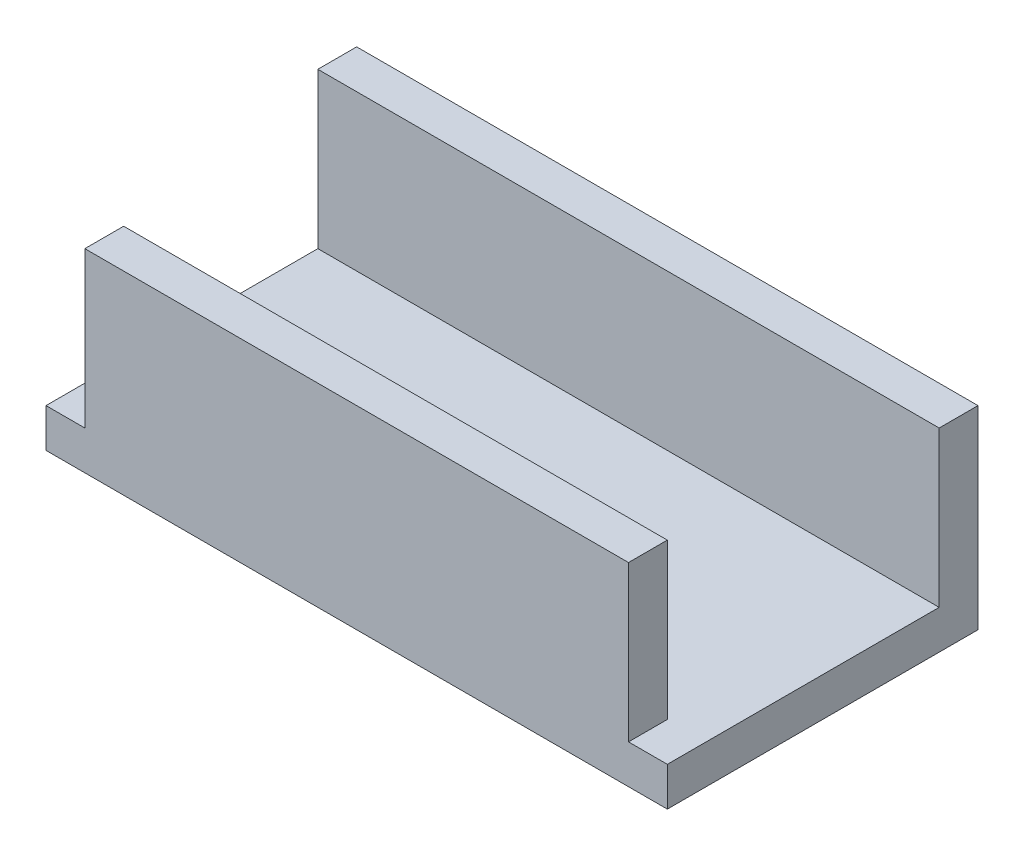
ISO-10303-21;
HEADER;
FILE_DESCRIPTION(('STEP AP214'),'2;1');
FILE_NAME('part.step','',(''),(''),'','','');
FILE_SCHEMA(('AUTOMOTIVE_DESIGN { 1 0 10303 214 1 1 1 1 }'));
ENDSEC;
DATA;
#1=APPLICATION_CONTEXT('core data for automotive mechanical design processes');
#2=APPLICATION_PROTOCOL_DEFINITION('international standard','automotive_design',2000,#1);
#3=PRODUCT_CONTEXT('',#1,'mechanical');
#4=PRODUCT('Part','Part','',(#3));
#5=PRODUCT_RELATED_PRODUCT_CATEGORY('part','',(#4));
#6=PRODUCT_DEFINITION_FORMATION('','',#4);
#7=PRODUCT_DEFINITION_CONTEXT('part definition',#1,'design');
#8=PRODUCT_DEFINITION('design','',#6,#7);
#9=PRODUCT_DEFINITION_SHAPE('','',#8);
#10=(LENGTH_UNIT() NAMED_UNIT(*) SI_UNIT(.MILLI.,.METRE.));
#11=(NAMED_UNIT(*) PLANE_ANGLE_UNIT() SI_UNIT($,.RADIAN.));
#12=(NAMED_UNIT(*) SI_UNIT($,.STERADIAN.) SOLID_ANGLE_UNIT());
#13=UNCERTAINTY_MEASURE_WITH_UNIT(LENGTH_MEASURE(1.E-05),#10,'distance_accuracy_value','');
#14=(GEOMETRIC_REPRESENTATION_CONTEXT(3) GLOBAL_UNCERTAINTY_ASSIGNED_CONTEXT((#13)) GLOBAL_UNIT_ASSIGNED_CONTEXT((#10,
#11,#12)) REPRESENTATION_CONTEXT('',''));
#15=CARTESIAN_POINT('',(0.,0.,0.));
#16=DIRECTION('',(0.,0.,1.));
#17=DIRECTION('',(1.,0.,0.));
#18=AXIS2_PLACEMENT_3D('',#15,#16,#17);
#19=CARTESIAN_POINT('',(3.14510667976366,22.664788813589,0.35));
#20=DIRECTION('',(0.,0.,1.));
#21=DIRECTION('',(-1.19248806385E-08,1.,0.));
#22=AXIS2_PLACEMENT_3D('',#19,#20,#21);
#23=PLANE('',#22);
#24=DIRECTION('',(1.19248806385E-08,-1.,0.));
#25=VECTOR('',#24,1.);
#26=CARTESIAN_POINT('',(3.89510667737868,22.8647888225327,0.35));
#27=LINE('',#26,#25);
#28=CARTESIAN_POINT('',(3.89510667737868,22.8647888225327,0.35));
#29=VERTEX_POINT('',#28);
#30=CARTESIAN_POINT('',(3.89510667976366,22.6647888225327,0.35));
#31=VERTEX_POINT('',#30);
#32=EDGE_CURVE('E11',#29,#31,#27,.T.);
#33=ORIENTED_EDGE('',*,*,#32,.T.);
#34=DIRECTION('',(-1.,-1.19248806385E-08,0.));
#35=VECTOR('',#34,1.);
#36=CARTESIAN_POINT('',(3.89510667976366,22.6647888225327,0.35));
#37=LINE('',#36,#35);
#38=CARTESIAN_POINT('',(3.19510667976366,22.6647888141853,0.35));
#39=VERTEX_POINT('',#38);
#40=EDGE_CURVE('E123',#31,#39,#37,.T.);
#41=ORIENTED_EDGE('',*,*,#40,.T.);
#42=DIRECTION('',(-1.19248806385E-08,1.,0.));
#43=VECTOR('',#42,1.);
#44=CARTESIAN_POINT('',(3.19510667976366,22.6647888141853,0.35));
#45=LINE('',#44,#43);
#46=CARTESIAN_POINT('',(3.19510667737868,22.8647888141853,0.35));
#47=VERTEX_POINT('',#46);
#48=EDGE_CURVE('E116',#39,#47,#45,.T.);
#49=ORIENTED_EDGE('',*,*,#48,.T.);
#50=DIRECTION('',(-1.,-1.19248806385E-08,0.));
#51=VECTOR('',#50,1.);
#52=CARTESIAN_POINT('',(3.89510667737868,22.8647888225327,0.35));
#53=LINE('',#52,#51);
#54=EDGE_CURVE('E108',#29,#47,#53,.T.);
#55=ORIENTED_EDGE('',*,*,#54,.F.);
#56=EDGE_LOOP('',(#33,#41,#49,#55));
#57=FACE_BOUND('',#56,.T.);
#58=ADVANCED_FACE('F16',(#57),#23,.F.);
#59=CARTESIAN_POINT('',(3.89510667737868,22.8647888225327,0.35));
#60=DIRECTION('',(-1.,-1.19248806385E-08,0.));
#61=DIRECTION('',(0.,0.,-1.));
#62=AXIS2_PLACEMENT_3D('',#59,#60,#61);
#63=PLANE('',#62);
#64=DIRECTION('',(0.,0.,-1.));
#65=VECTOR('',#64,1.);
#66=CARTESIAN_POINT('',(3.89510667976366,22.6647888225327,0.4));
#67=LINE('',#66,#65);
#68=CARTESIAN_POINT('',(3.89510667976366,22.6647888225327,0.4));
#69=VERTEX_POINT('',#68);
#70=EDGE_CURVE('E127',#69,#31,#67,.T.);
#71=ORIENTED_EDGE('',*,*,#70,.T.);
#72=ORIENTED_EDGE('',*,*,#32,.F.);
#73=DIRECTION('',(0.,0.,-1.));
#74=VECTOR('',#73,1.);
#75=CARTESIAN_POINT('',(3.89510667737868,22.8647888225327,0.4));
#76=LINE('',#75,#74);
#77=CARTESIAN_POINT('',(3.89510667737868,22.8647888225327,0.4));
#78=VERTEX_POINT('',#77);
#79=EDGE_CURVE('E113',#78,#29,#76,.T.);
#80=ORIENTED_EDGE('',*,*,#79,.F.);
#81=DIRECTION('',(1.19248806385E-08,-1.,0.));
#82=VECTOR('',#81,1.);
#83=CARTESIAN_POINT('',(3.89510667737868,22.8647888225327,0.4));
#84=LINE('',#83,#82);
#85=EDGE_CURVE('E132',#78,#69,#84,.T.);
#86=ORIENTED_EDGE('',*,*,#85,.T.);
#87=EDGE_LOOP('',(#71,#72,#80,#86));
#88=FACE_BOUND('',#87,.T.);
#89=ADVANCED_FACE('F324',(#88),#63,.F.);
#90=CARTESIAN_POINT('',(3.14510667737868,22.8647888135891,0.35));
#91=DIRECTION('',(-1.19248806385E-08,1.,0.));
#92=DIRECTION('',(1.,1.19248806385E-08,0.));
#93=AXIS2_PLACEMENT_3D('',#90,#91,#92);
#94=PLANE('',#93);
#95=DIRECTION('',(-1.,-1.19248806385E-08,0.));
#96=VECTOR('',#95,1.);
#97=CARTESIAN_POINT('',(3.14510667737868,22.8647888135891,0.));
#98=LINE('',#97,#96);
#99=CARTESIAN_POINT('',(3.94510667737869,22.864788823129,0.));
#100=VERTEX_POINT('',#99);
#101=CARTESIAN_POINT('',(3.14510667737868,22.8647888135891,0.));
#102=VERTEX_POINT('',#101);
#103=EDGE_CURVE('E27',#100,#102,#98,.T.);
#104=ORIENTED_EDGE('',*,*,#103,.T.);
#105=DIRECTION('',(0.,0.,1.));
#106=VECTOR('',#105,1.);
#107=CARTESIAN_POINT('',(3.14510667737868,22.8647888135891,0.35));
#108=LINE('',#107,#106);
#109=CARTESIAN_POINT('',(3.14510667737868,22.8647888135891,0.05));
#110=VERTEX_POINT('',#109);
#111=EDGE_CURVE('E72',#102,#110,#108,.T.);
#112=ORIENTED_EDGE('',*,*,#111,.T.);
#113=DIRECTION('',(-1.,-1.19248806385E-08,0.));
#114=VECTOR('',#113,1.);
#115=CARTESIAN_POINT('',(3.14510667737868,22.8647888135891,0.05));
#116=LINE('',#115,#114);
#117=CARTESIAN_POINT('',(3.94510667737869,22.864788823129,0.05));
#118=VERTEX_POINT('',#117);
#119=EDGE_CURVE('E76',#118,#110,#116,.T.);
#120=ORIENTED_EDGE('',*,*,#119,.F.);
#121=DIRECTION('',(0.,0.,1.));
#122=VECTOR('',#121,1.);
#123=CARTESIAN_POINT('',(3.94510667737869,22.864788823129,0.05));
#124=LINE('',#123,#122);
#125=EDGE_CURVE('E20',#100,#118,#124,.T.);
#126=ORIENTED_EDGE('',*,*,#125,.F.);
#127=EDGE_LOOP('',(#104,#112,#120,#126));
#128=FACE_BOUND('',#127,.T.);
#129=ADVANCED_FACE('F18',(#128),#94,.T.);
#130=CARTESIAN_POINT('',(3.14510667737868,22.8647888135891,0.));
#131=DIRECTION('',(0.,0.,-1.));
#132=DIRECTION('',(1.19248806385E-08,-1.,0.));
#133=AXIS2_PLACEMENT_3D('',#130,#131,#132);
#134=PLANE('',#133);
#135=DIRECTION('',(-1.,-1.19248806385E-08,0.));
#136=VECTOR('',#135,1.);
#137=CARTESIAN_POINT('',(3.9451066803599,22.614788823129,0.));
#138=LINE('',#137,#136);
#139=CARTESIAN_POINT('',(3.9451066803599,22.614788823129,0.));
#140=VERTEX_POINT('',#139);
#141=CARTESIAN_POINT('',(3.1451066803599,22.6147888135891,0.));
#142=VERTEX_POINT('',#141);
#143=EDGE_CURVE('E39',#140,#142,#138,.T.);
#144=ORIENTED_EDGE('',*,*,#143,.T.);
#145=DIRECTION('',(-1.19248806385E-08,1.,0.));
#146=VECTOR('',#145,1.);
#147=CARTESIAN_POINT('',(3.1451066803599,22.6147888135891,0.));
#148=LINE('',#147,#146);
#149=EDGE_CURVE('E81',#142,#102,#148,.T.);
#150=ORIENTED_EDGE('',*,*,#149,.T.);
#151=ORIENTED_EDGE('',*,*,#103,.F.);
#152=DIRECTION('',(-1.19248806385E-08,1.,0.));
#153=VECTOR('',#152,1.);
#154=CARTESIAN_POINT('',(3.9451066803599,22.614788823129,0.));
#155=LINE('',#154,#153);
#156=EDGE_CURVE('E152',#140,#100,#155,.T.);
#157=ORIENTED_EDGE('',*,*,#156,.F.);
#158=EDGE_LOOP('',(#144,#150,#151,#157));
#159=FACE_BOUND('',#158,.T.);
#160=ADVANCED_FACE('F346',(#159),#134,.T.);
#161=CARTESIAN_POINT('',(3.1451066803599,22.6147888135891,0.05));
#162=DIRECTION('',(1.19248806385E-08,-1.,0.));
#163=DIRECTION('',(0.,0.,1.));
#164=AXIS2_PLACEMENT_3D('',#161,#162,#163);
#165=PLANE('',#164);
#166=DIRECTION('',(-1.,-1.19248806385E-08,0.));
#167=VECTOR('',#166,1.);
#168=CARTESIAN_POINT('',(3.9451066803599,22.614788823129,0.4));
#169=LINE('',#168,#167);
#170=CARTESIAN_POINT('',(3.9451066803599,22.614788823129,0.4));
#171=VERTEX_POINT('',#170);
#172=CARTESIAN_POINT('',(3.1451066803599,22.6147888135891,0.4));
#173=VERTEX_POINT('',#172);
#174=EDGE_CURVE('E177',#171,#173,#169,.T.);
#175=ORIENTED_EDGE('',*,*,#174,.T.);
#176=DIRECTION('',(0.,0.,-1.));
#177=VECTOR('',#176,1.);
#178=CARTESIAN_POINT('',(3.1451066803599,22.6147888135891,0.4));
#179=LINE('',#178,#177);
#180=EDGE_CURVE('E161',#173,#142,#179,.T.);
#181=ORIENTED_EDGE('',*,*,#180,.T.);
#182=ORIENTED_EDGE('',*,*,#143,.F.);
#183=DIRECTION('',(0.,0.,-1.));
#184=VECTOR('',#183,1.);
#185=CARTESIAN_POINT('',(3.9451066803599,22.614788823129,0.4));
#186=LINE('',#185,#184);
#187=EDGE_CURVE('E156',#171,#140,#186,.T.);
#188=ORIENTED_EDGE('',*,*,#187,.F.);
#189=EDGE_LOOP('',(#175,#181,#182,#188));
#190=FACE_BOUND('',#189,.T.);
#191=ADVANCED_FACE('F302',(#190),#165,.T.);
#192=CARTESIAN_POINT('',(3.14510667976366,22.664788813589,0.35));
#193=DIRECTION('',(-1.,-1.19248806385E-08,0.));
#194=DIRECTION('',(-1.19248806385E-08,1.,0.));
#195=AXIS2_PLACEMENT_3D('',#192,#193,#194);
#196=PLANE('',#195);
#197=DIRECTION('',(-1.19248806385E-08,1.,0.));
#198=VECTOR('',#197,1.);
#199=CARTESIAN_POINT('',(3.14510667976366,22.664788813589,0.05));
#200=LINE('',#199,#198);
#201=CARTESIAN_POINT('',(3.14510667976366,22.664788813589,0.05));
#202=VERTEX_POINT('',#201);
#203=EDGE_CURVE('E82',#202,#110,#200,.T.);
#204=ORIENTED_EDGE('',*,*,#203,.T.);
#205=ORIENTED_EDGE('',*,*,#111,.F.);
#206=ORIENTED_EDGE('',*,*,#149,.F.);
#207=ORIENTED_EDGE('',*,*,#180,.F.);
#208=DIRECTION('',(1.19248806385E-08,-1.,0.));
#209=VECTOR('',#208,1.);
#210=CARTESIAN_POINT('',(3.14510667976366,22.664788813589,0.4));
#211=LINE('',#210,#209);
#212=CARTESIAN_POINT('',(3.14510667976366,22.664788813589,0.4));
#213=VERTEX_POINT('',#212);
#214=EDGE_CURVE('E182',#213,#173,#211,.T.);
#215=ORIENTED_EDGE('',*,*,#214,.F.);
#216=DIRECTION('',(0.,0.,-1.));
#217=VECTOR('',#216,1.);
#218=CARTESIAN_POINT('',(3.14510667976366,22.664788813589,0.4));
#219=LINE('',#218,#217);
#220=EDGE_CURVE('E89',#213,#202,#219,.T.);
#221=ORIENTED_EDGE('',*,*,#220,.T.);
#222=EDGE_LOOP('',(#204,#205,#206,#207,#215,#221));
#223=FACE_BOUND('',#222,.T.);
#224=ADVANCED_FACE('F86',(#223),#196,.T.);
#225=CARTESIAN_POINT('',(3.14510667737868,22.8647888135891,0.05));
#226=DIRECTION('',(0.,0.,-1.));
#227=DIRECTION('',(1.19248806385E-08,-1.,0.));
#228=AXIS2_PLACEMENT_3D('',#225,#226,#227);
#229=PLANE('',#228);
#230=ORIENTED_EDGE('',*,*,#119,.T.);
#231=ORIENTED_EDGE('',*,*,#203,.F.);
#232=DIRECTION('',(-1.,-1.19248806385E-08,0.));
#233=VECTOR('',#232,1.);
#234=CARTESIAN_POINT('',(3.94510667976366,22.6647888231289,0.05));
#235=LINE('',#234,#233);
#236=CARTESIAN_POINT('',(3.94510667976366,22.6647888231289,0.05));
#237=VERTEX_POINT('',#236);
#238=EDGE_CURVE('E187',#237,#202,#235,.T.);
#239=ORIENTED_EDGE('',*,*,#238,.F.);
#240=DIRECTION('',(-1.19248806385E-08,1.,0.));
#241=VECTOR('',#240,1.);
#242=CARTESIAN_POINT('',(3.94510667976366,22.6647888231289,0.05));
#243=LINE('',#242,#241);
#244=EDGE_CURVE('E97',#237,#118,#243,.T.);
#245=ORIENTED_EDGE('',*,*,#244,.T.);
#246=EDGE_LOOP('',(#230,#231,#239,#245));
#247=FACE_BOUND('',#246,.T.);
#248=ADVANCED_FACE('F95',(#247),#229,.F.);
#249=CARTESIAN_POINT('',(3.94510667976366,22.6647888231289,0.05));
#250=DIRECTION('',(-1.,-1.19248806385E-08,0.));
#251=DIRECTION('',(0.,0.,1.));
#252=AXIS2_PLACEMENT_3D('',#249,#250,#251);
#253=PLANE('',#252);
#254=ORIENTED_EDGE('',*,*,#187,.T.);
#255=ORIENTED_EDGE('',*,*,#156,.T.);
#256=ORIENTED_EDGE('',*,*,#125,.T.);
#257=ORIENTED_EDGE('',*,*,#244,.F.);
#258=DIRECTION('',(0.,0.,-1.));
#259=VECTOR('',#258,1.);
#260=CARTESIAN_POINT('',(3.94510667976366,22.6647888231289,0.4));
#261=LINE('',#260,#259);
#262=CARTESIAN_POINT('',(3.94510667976366,22.6647888231289,0.4));
#263=VERTEX_POINT('',#262);
#264=EDGE_CURVE('E149',#263,#237,#261,.T.);
#265=ORIENTED_EDGE('',*,*,#264,.F.);
#266=DIRECTION('',(1.19248806385E-08,-1.,0.));
#267=VECTOR('',#266,1.);
#268=CARTESIAN_POINT('',(3.94510667976366,22.6647888231289,0.4));
#269=LINE('',#268,#267);
#270=EDGE_CURVE('E181',#263,#171,#269,.T.);
#271=ORIENTED_EDGE('',*,*,#270,.T.);
#272=EDGE_LOOP('',(#254,#255,#256,#257,#265,#271));
#273=FACE_BOUND('',#272,.T.);
#274=ADVANCED_FACE('F326',(#273),#253,.F.);
#275=CARTESIAN_POINT('',(3.14510667976366,22.664788813589,0.05));
#276=DIRECTION('',(1.19248806385E-08,-1.,0.));
#277=DIRECTION('',(0.,0.,1.));
#278=AXIS2_PLACEMENT_3D('',#275,#276,#277);
#279=PLANE('',#278);
#280=ORIENTED_EDGE('',*,*,#238,.T.);
#281=ORIENTED_EDGE('',*,*,#220,.F.);
#282=DIRECTION('',(1.,1.19248806385E-08,0.));
#283=VECTOR('',#282,1.);
#284=CARTESIAN_POINT('',(3.14510667976366,22.664788813589,0.4));
#285=LINE('',#284,#283);
#286=CARTESIAN_POINT('',(3.19510667976366,22.6647888141853,0.4));
#287=VERTEX_POINT('',#286);
#288=EDGE_CURVE('E136',#213,#287,#285,.T.);
#289=ORIENTED_EDGE('',*,*,#288,.T.);
#290=DIRECTION('',(0.,0.,-1.));
#291=VECTOR('',#290,1.);
#292=CARTESIAN_POINT('',(3.19510667976366,22.6647888141853,0.4));
#293=LINE('',#292,#291);
#294=EDGE_CURVE('E120',#287,#39,#293,.T.);
#295=ORIENTED_EDGE('',*,*,#294,.T.);
#296=ORIENTED_EDGE('',*,*,#40,.F.);
#297=ORIENTED_EDGE('',*,*,#70,.F.);
#298=DIRECTION('',(1.,1.19248806385E-08,0.));
#299=VECTOR('',#298,1.);
#300=CARTESIAN_POINT('',(3.89510667976366,22.6647888225327,0.4));
#301=LINE('',#300,#299);
#302=EDGE_CURVE('E137',#69,#263,#301,.T.);
#303=ORIENTED_EDGE('',*,*,#302,.T.);
#304=ORIENTED_EDGE('',*,*,#264,.T.);
#305=EDGE_LOOP('',(#280,#281,#289,#295,#296,#297,#303,#304));
#306=FACE_BOUND('',#305,.T.);
#307=ADVANCED_FACE('F263',(#306),#279,.F.);
#308=CARTESIAN_POINT('',(3.14510667976366,22.664788813589,0.4));
#309=DIRECTION('',(0.,0.,1.));
#310=DIRECTION('',(-1.19248806385E-08,1.,0.));
#311=AXIS2_PLACEMENT_3D('',#308,#309,#310);
#312=PLANE('',#311);
#313=ORIENTED_EDGE('',*,*,#214,.T.);
#314=ORIENTED_EDGE('',*,*,#174,.F.);
#315=ORIENTED_EDGE('',*,*,#270,.F.);
#316=ORIENTED_EDGE('',*,*,#302,.F.);
#317=ORIENTED_EDGE('',*,*,#85,.F.);
#318=DIRECTION('',(-1.,-1.19248806385E-08,0.));
#319=VECTOR('',#318,1.);
#320=CARTESIAN_POINT('',(3.89510667737868,22.8647888225327,0.4));
#321=LINE('',#320,#319);
#322=CARTESIAN_POINT('',(3.19510667737868,22.8647888141853,0.4));
#323=VERTEX_POINT('',#322);
#324=EDGE_CURVE('E143',#78,#323,#321,.T.);
#325=ORIENTED_EDGE('',*,*,#324,.T.);
#326=DIRECTION('',(-1.19248806385E-08,1.,0.));
#327=VECTOR('',#326,1.);
#328=CARTESIAN_POINT('',(3.19510667976366,22.6647888141853,0.4));
#329=LINE('',#328,#327);
#330=EDGE_CURVE('E193',#287,#323,#329,.T.);
#331=ORIENTED_EDGE('',*,*,#330,.F.);
#332=ORIENTED_EDGE('',*,*,#288,.F.);
#333=EDGE_LOOP('',(#313,#314,#315,#316,#317,#325,#331,#332));
#334=FACE_BOUND('',#333,.T.);
#335=ADVANCED_FACE('F305',(#334),#312,.T.);
#336=CARTESIAN_POINT('',(3.19510667737868,22.8647888141853,0.35));
#337=DIRECTION('',(1.,1.19248806385E-08,0.));
#338=DIRECTION('',(1.19248806385E-08,-1.,0.));
#339=AXIS2_PLACEMENT_3D('',#336,#337,#338);
#340=PLANE('',#339);
#341=DIRECTION('',(0.,0.,-1.));
#342=VECTOR('',#341,1.);
#343=CARTESIAN_POINT('',(3.19510667737868,22.8647888141853,0.4));
#344=LINE('',#343,#342);
#345=EDGE_CURVE('E112',#323,#47,#344,.T.);
#346=ORIENTED_EDGE('',*,*,#345,.T.);
#347=ORIENTED_EDGE('',*,*,#48,.F.);
#348=ORIENTED_EDGE('',*,*,#294,.F.);
#349=ORIENTED_EDGE('',*,*,#330,.T.);
#350=EDGE_LOOP('',(#346,#347,#348,#349));
#351=FACE_BOUND('',#350,.T.);
#352=ADVANCED_FACE('F245',(#351),#340,.F.);
#353=CARTESIAN_POINT('',(3.14510667737868,22.8647888135891,0.35));
#354=DIRECTION('',(-1.19248806385E-08,1.,0.));
#355=DIRECTION('',(1.,1.19248806385E-08,0.));
#356=AXIS2_PLACEMENT_3D('',#353,#354,#355);
#357=PLANE('',#356);
#358=ORIENTED_EDGE('',*,*,#324,.F.);
#359=ORIENTED_EDGE('',*,*,#79,.T.);
#360=ORIENTED_EDGE('',*,*,#54,.T.);
#361=ORIENTED_EDGE('',*,*,#345,.F.);
#362=EDGE_LOOP('',(#358,#359,#360,#361));
#363=FACE_BOUND('',#362,.T.);
#364=ADVANCED_FACE('F254',(#363),#357,.T.);
#365=CLOSED_SHELL('',(#58,#89,#129,#160,#191,#224,#248,#274,#307,#335,#352,#364));
#366=MANIFOLD_SOLID_BREP('B1',#365);
#367=ADVANCED_BREP_SHAPE_REPRESENTATION('',(#18,#366),#14);
#368=SHAPE_DEFINITION_REPRESENTATION(#9,#367);
ENDSEC;
END-ISO-10303-21;
